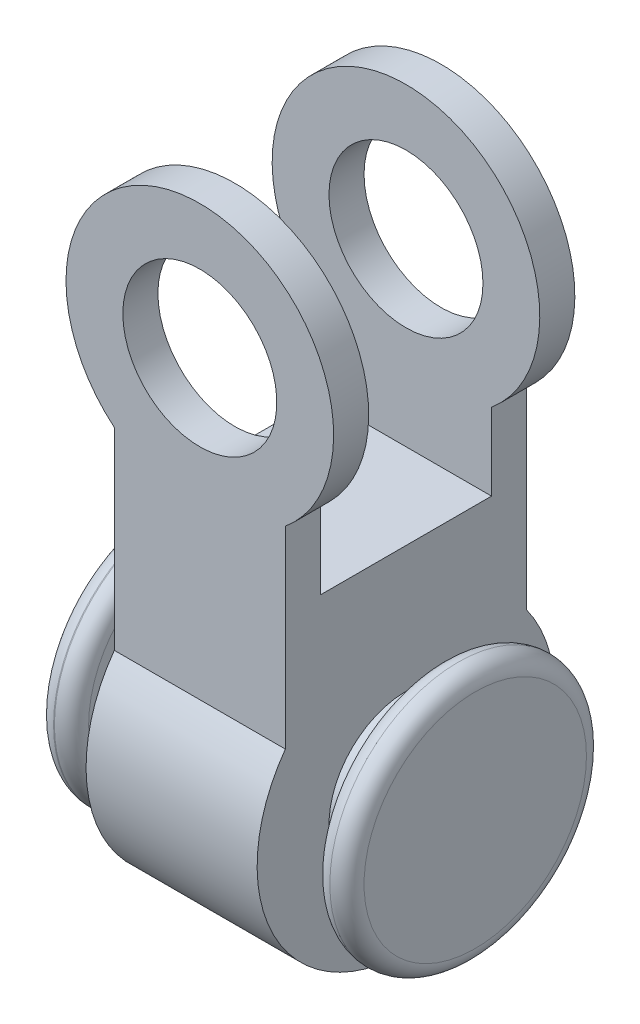
ISO-10303-21;
HEADER;
FILE_DESCRIPTION(('STEP AP214'),'2;1');
FILE_NAME('part.step','',(''),(''),'','','');
FILE_SCHEMA(('AUTOMOTIVE_DESIGN { 1 0 10303 214 1 1 1 1 }'));
ENDSEC;
DATA;
#1=APPLICATION_CONTEXT('core data for automotive mechanical design processes');
#2=APPLICATION_PROTOCOL_DEFINITION('international standard','automotive_design',2000,#1);
#3=PRODUCT_CONTEXT('',#1,'mechanical');
#4=PRODUCT('Part','Part','',(#3));
#5=PRODUCT_RELATED_PRODUCT_CATEGORY('part','',(#4));
#6=PRODUCT_DEFINITION_FORMATION('','',#4);
#7=PRODUCT_DEFINITION_CONTEXT('part definition',#1,'design');
#8=PRODUCT_DEFINITION('design','',#6,#7);
#9=PRODUCT_DEFINITION_SHAPE('','',#8);
#10=(LENGTH_UNIT() NAMED_UNIT(*) SI_UNIT(.MILLI.,.METRE.));
#11=(NAMED_UNIT(*) PLANE_ANGLE_UNIT() SI_UNIT($,.RADIAN.));
#12=(NAMED_UNIT(*) SI_UNIT($,.STERADIAN.) SOLID_ANGLE_UNIT());
#13=UNCERTAINTY_MEASURE_WITH_UNIT(LENGTH_MEASURE(1.E-05),#10,'distance_accuracy_value','');
#14=(GEOMETRIC_REPRESENTATION_CONTEXT(3) GLOBAL_UNCERTAINTY_ASSIGNED_CONTEXT((#13)) GLOBAL_UNIT_ASSIGNED_CONTEXT((#10,
#11,#12)) REPRESENTATION_CONTEXT('',''));
#15=CARTESIAN_POINT('',(0.,0.,0.));
#16=DIRECTION('',(0.,0.,1.));
#17=DIRECTION('',(1.,0.,0.));
#18=AXIS2_PLACEMENT_3D('',#15,#16,#17);
#19=CARTESIAN_POINT('',(100.,0.,0.));
#20=DIRECTION('',(1.,0.,0.));
#21=DIRECTION('',(0.,0.,-1.));
#22=AXIS2_PLACEMENT_3D('',#19,#20,#21);
#23=PLANE('',#22);
#24=CARTESIAN_POINT('',(100.,0.,0.));
#25=DIRECTION('',(1.,0.,0.));
#26=DIRECTION('',(0.,0.,-1.));
#27=AXIS2_PLACEMENT_3D('',#24,#25,#26);
#28=CIRCLE('',#27,45.);
#29=CARTESIAN_POINT('',(100.,0.,-45.));
#30=VERTEX_POINT('',#29);
#31=EDGE_CURVE('E176',#30,#30,#28,.T.);
#32=ORIENTED_EDGE('',*,*,#31,.F.);
#33=EDGE_LOOP('',(#32));
#34=FACE_BOUND('',#33,.T.);
#35=DIRECTION('',(0.,0.,1.));
#36=VECTOR('',#35,1.);
#37=CARTESIAN_POINT('',(100.,118.8,0.));
#38=LINE('',#37,#36);
#39=CARTESIAN_POINT('',(100.,118.8,-50.));
#40=VERTEX_POINT('',#39);
#41=CARTESIAN_POINT('',(100.,118.8,50.));
#42=VERTEX_POINT('',#41);
#43=EDGE_CURVE('E110',#40,#42,#38,.T.);
#44=ORIENTED_EDGE('',*,*,#43,.T.);
#45=DIRECTION('',(0.,1.,0.));
#46=VECTOR('',#45,1.);
#47=CARTESIAN_POINT('',(100.,0.,50.));
#48=LINE('',#47,#46);
#49=CARTESIAN_POINT('',(99.9999999999999,163.846653628768,50.));
#50=VERTEX_POINT('',#49);
#51=EDGE_CURVE('E121',#42,#50,#48,.T.);
#52=ORIENTED_EDGE('',*,*,#51,.T.);
#53=DIRECTION('',(0.,0.,-1.));
#54=VECTOR('',#53,1.);
#55=CARTESIAN_POINT('',(99.9999999999999,163.846653628768,70.5));
#56=LINE('',#55,#54);
#57=CARTESIAN_POINT('',(99.9999999999999,163.846653628768,70.5));
#58=VERTEX_POINT('',#57);
#59=EDGE_CURVE('E144',#58,#50,#56,.T.);
#60=ORIENTED_EDGE('',*,*,#59,.F.);
#61=DIRECTION('',(0.,1.,0.));
#62=VECTOR('',#61,1.);
#63=CARTESIAN_POINT('',(100.,-87.002,70.5));
#64=LINE('',#63,#62);
#65=CARTESIAN_POINT('',(100.,50.9779364038993,70.5));
#66=VERTEX_POINT('',#65);
#67=EDGE_CURVE('E156',#66,#58,#64,.T.);
#68=ORIENTED_EDGE('',*,*,#67,.F.);
#69=CARTESIAN_POINT('',(100.,0.,0.));
#70=DIRECTION('',(1.,0.,0.));
#71=DIRECTION('',(0.,0.,-1.));
#72=AXIS2_PLACEMENT_3D('',#69,#70,#71);
#73=CIRCLE('',#72,87.);
#74=CARTESIAN_POINT('',(100.,50.9779364038993,-70.5));
#75=VERTEX_POINT('',#74);
#76=EDGE_CURVE('E180',#66,#75,#73,.T.);
#77=ORIENTED_EDGE('',*,*,#76,.T.);
#78=DIRECTION('',(0.,1.,0.));
#79=VECTOR('',#78,1.);
#80=CARTESIAN_POINT('',(100.,-87.002,-70.5));
#81=LINE('',#80,#79);
#82=CARTESIAN_POINT('',(99.9999999999999,163.846653628768,-70.5));
#83=VERTEX_POINT('',#82);
#84=EDGE_CURVE('E153',#75,#83,#81,.T.);
#85=ORIENTED_EDGE('',*,*,#84,.T.);
#86=CARTESIAN_POINT('',(99.9999999999999,163.846653628768,-50.));
#87=VERTEX_POINT('',#86);
#88=EDGE_CURVE('E147',#87,#83,#56,.T.);
#89=ORIENTED_EDGE('',*,*,#88,.F.);
#90=DIRECTION('',(0.,-1.,0.));
#91=VECTOR('',#90,1.);
#92=CARTESIAN_POINT('',(100.,0.,-50.));
#93=LINE('',#92,#91);
#94=EDGE_CURVE('E47',#87,#40,#93,.T.);
#95=ORIENTED_EDGE('',*,*,#94,.T.);
#96=EDGE_LOOP('',(#44,#52,#60,#68,#77,#85,#89,#95));
#97=FACE_BOUND('',#96,.T.);
#98=ADVANCED_FACE('F32',(#34,#97),#23,.T.);
#99=CARTESIAN_POINT('',(0.,0.,0.));
#100=DIRECTION('',(1.,0.,0.));
#101=DIRECTION('',(0.,0.,-1.));
#102=AXIS2_PLACEMENT_3D('',#99,#100,#101);
#103=PLANE('',#102);
#104=CARTESIAN_POINT('',(0.,0.,0.));
#105=DIRECTION('',(-1.,0.,0.));
#106=DIRECTION('',(0.,0.,1.));
#107=AXIS2_PLACEMENT_3D('',#104,#105,#106);
#108=CIRCLE('',#107,45.);
#109=CARTESIAN_POINT('',(0.,0.,45.));
#110=VERTEX_POINT('',#109);
#111=EDGE_CURVE('E167',#110,#110,#108,.T.);
#112=ORIENTED_EDGE('',*,*,#111,.F.);
#113=EDGE_LOOP('',(#112));
#114=FACE_BOUND('',#113,.T.);
#115=DIRECTION('',(0.,1.,0.));
#116=VECTOR('',#115,1.);
#117=CARTESIAN_POINT('',(0.,0.,50.));
#118=LINE('',#117,#116);
#119=CARTESIAN_POINT('',(0.,118.8,50.));
#120=VERTEX_POINT('',#119);
#121=CARTESIAN_POINT('',(0.,163.846653628768,50.));
#122=VERTEX_POINT('',#121);
#123=EDGE_CURVE('E116',#120,#122,#118,.T.);
#124=ORIENTED_EDGE('',*,*,#123,.F.);
#125=DIRECTION('',(0.,0.,1.));
#126=VECTOR('',#125,1.);
#127=CARTESIAN_POINT('',(0.,118.8,0.));
#128=LINE('',#127,#126);
#129=CARTESIAN_POINT('',(0.,118.8,-50.));
#130=VERTEX_POINT('',#129);
#131=EDGE_CURVE('E11',#130,#120,#128,.T.);
#132=ORIENTED_EDGE('',*,*,#131,.F.);
#133=DIRECTION('',(0.,-1.,0.));
#134=VECTOR('',#133,1.);
#135=CARTESIAN_POINT('',(0.,0.,-50.));
#136=LINE('',#135,#134);
#137=CARTESIAN_POINT('',(0.,163.846653628768,-50.));
#138=VERTEX_POINT('',#137);
#139=EDGE_CURVE('E95',#138,#130,#136,.T.);
#140=ORIENTED_EDGE('',*,*,#139,.F.);
#141=DIRECTION('',(0.,0.,-1.));
#142=VECTOR('',#141,1.);
#143=CARTESIAN_POINT('',(0.,163.846653628768,70.5));
#144=LINE('',#143,#142);
#145=CARTESIAN_POINT('',(0.,163.846653628768,-70.5));
#146=VERTEX_POINT('',#145);
#147=EDGE_CURVE('E141',#138,#146,#144,.T.);
#148=ORIENTED_EDGE('',*,*,#147,.T.);
#149=DIRECTION('',(0.,1.,0.));
#150=VECTOR('',#149,1.);
#151=CARTESIAN_POINT('',(0.,-87.002,-70.5));
#152=LINE('',#151,#150);
#153=CARTESIAN_POINT('',(0.,50.9779364038993,-70.5));
#154=VERTEX_POINT('',#153);
#155=EDGE_CURVE('E150',#154,#146,#152,.T.);
#156=ORIENTED_EDGE('',*,*,#155,.F.);
#157=CARTESIAN_POINT('',(0.,0.,0.));
#158=DIRECTION('',(1.,0.,0.));
#159=DIRECTION('',(0.,0.,-1.));
#160=AXIS2_PLACEMENT_3D('',#157,#158,#159);
#161=CIRCLE('',#160,87.);
#162=CARTESIAN_POINT('',(0.,50.9779364038993,70.5));
#163=VERTEX_POINT('',#162);
#164=EDGE_CURVE('E175',#163,#154,#161,.T.);
#165=ORIENTED_EDGE('',*,*,#164,.F.);
#166=DIRECTION('',(0.,1.,0.));
#167=VECTOR('',#166,1.);
#168=CARTESIAN_POINT('',(0.,-87.002,70.5));
#169=LINE('',#168,#167);
#170=CARTESIAN_POINT('',(0.,163.846653628768,70.5));
#171=VERTEX_POINT('',#170);
#172=EDGE_CURVE('E157',#163,#171,#169,.T.);
#173=ORIENTED_EDGE('',*,*,#172,.T.);
#174=EDGE_CURVE('E118',#171,#122,#144,.T.);
#175=ORIENTED_EDGE('',*,*,#174,.T.);
#176=EDGE_LOOP('',(#124,#132,#140,#148,#156,#165,#173,#175));
#177=FACE_BOUND('',#176,.T.);
#178=ADVANCED_FACE('F114',(#114,#177),#103,.F.);
#179=CARTESIAN_POINT('',(50.,224.,70.5));
#180=DIRECTION('',(0.,0.,-1.));
#181=DIRECTION('',(-1.,0.,0.));
#182=AXIS2_PLACEMENT_3D('',#179,#180,#181);
#183=CYLINDRICAL_SURFACE('',#182,78.2203623084004);
#184=ORIENTED_EDGE('',*,*,#59,.T.);
#185=CARTESIAN_POINT('',(50.,224.,50.));
#186=DIRECTION('',(0.,0.,-1.));
#187=DIRECTION('',(-1.,0.,0.));
#188=AXIS2_PLACEMENT_3D('',#185,#186,#187);
#189=CIRCLE('',#188,78.2203623084004);
#190=EDGE_CURVE('E122',#50,#122,#189,.F.);
#191=ORIENTED_EDGE('',*,*,#190,.T.);
#192=ORIENTED_EDGE('',*,*,#174,.F.);
#193=CARTESIAN_POINT('',(50.,224.,70.5));
#194=DIRECTION('',(0.,0.,-1.));
#195=DIRECTION('',(-1.,0.,0.));
#196=AXIS2_PLACEMENT_3D('',#193,#194,#195);
#197=CIRCLE('',#196,78.2203623084004);
#198=EDGE_CURVE('E138',#171,#58,#197,.T.);
#199=ORIENTED_EDGE('',*,*,#198,.T.);
#200=EDGE_LOOP('',(#184,#191,#192,#199));
#201=FACE_BOUND('',#200,.T.);
#202=ADVANCED_FACE('F211',(#201),#183,.T.);
#203=ORIENTED_EDGE('',*,*,#147,.F.);
#204=CARTESIAN_POINT('',(50.,224.,-50.));
#205=DIRECTION('',(0.,0.,1.));
#206=DIRECTION('',(1.,0.,0.));
#207=AXIS2_PLACEMENT_3D('',#204,#205,#206);
#208=CIRCLE('',#207,78.2203623084004);
#209=EDGE_CURVE('E100',#138,#87,#208,.F.);
#210=ORIENTED_EDGE('',*,*,#209,.T.);
#211=ORIENTED_EDGE('',*,*,#88,.T.);
#212=CARTESIAN_POINT('',(50.,224.,-70.5));
#213=DIRECTION('',(0.,0.,-1.));
#214=DIRECTION('',(-1.,0.,0.));
#215=AXIS2_PLACEMENT_3D('',#212,#213,#214);
#216=CIRCLE('',#215,78.2203623084004);
#217=EDGE_CURVE('E135',#146,#83,#216,.T.);
#218=ORIENTED_EDGE('',*,*,#217,.F.);
#219=EDGE_LOOP('',(#203,#210,#211,#218));
#220=FACE_BOUND('',#219,.T.);
#221=ADVANCED_FACE('F225',(#220),#183,.T.);
#222=CARTESIAN_POINT('',(50.,224.,70.5));
#223=DIRECTION('',(0.,0.,-1.));
#224=DIRECTION('',(-1.,0.,0.));
#225=AXIS2_PLACEMENT_3D('',#222,#223,#224);
#226=CYLINDRICAL_SURFACE('',#225,45.);
#227=CARTESIAN_POINT('',(50.,224.,70.5));
#228=DIRECTION('',(0.,0.,-1.));
#229=DIRECTION('',(-1.,0.,0.));
#230=AXIS2_PLACEMENT_3D('',#227,#228,#229);
#231=CIRCLE('',#230,45.);
#232=CARTESIAN_POINT('',(4.99999999999999,224.,70.5));
#233=VERTEX_POINT('',#232);
#234=EDGE_CURVE('E132',#233,#233,#231,.T.);
#235=ORIENTED_EDGE('',*,*,#234,.F.);
#236=EDGE_LOOP('',(#235));
#237=FACE_BOUND('',#236,.T.);
#238=CARTESIAN_POINT('',(50.,224.,50.));
#239=DIRECTION('',(0.,0.,-1.));
#240=DIRECTION('',(-1.,0.,0.));
#241=AXIS2_PLACEMENT_3D('',#238,#239,#240);
#242=CIRCLE('',#241,45.);
#243=CARTESIAN_POINT('',(4.99999999999999,224.,50.));
#244=VERTEX_POINT('',#243);
#245=EDGE_CURVE('E126',#244,#244,#242,.F.);
#246=ORIENTED_EDGE('',*,*,#245,.F.);
#247=EDGE_LOOP('',(#246));
#248=FACE_BOUND('',#247,.T.);
#249=ADVANCED_FACE('F238',(#237,#248),#226,.F.);
#250=CARTESIAN_POINT('',(50.,224.,-70.5));
#251=DIRECTION('',(0.,0.,-1.));
#252=DIRECTION('',(-1.,0.,0.));
#253=AXIS2_PLACEMENT_3D('',#250,#251,#252);
#254=CIRCLE('',#253,45.);
#255=CARTESIAN_POINT('',(5.00000000000001,224.,-70.5));
#256=VERTEX_POINT('',#255);
#257=EDGE_CURVE('E131',#256,#256,#254,.T.);
#258=ORIENTED_EDGE('',*,*,#257,.T.);
#259=EDGE_LOOP('',(#258));
#260=FACE_BOUND('',#259,.T.);
#261=CARTESIAN_POINT('',(50.,224.,-50.));
#262=DIRECTION('',(0.,0.,1.));
#263=DIRECTION('',(1.,0.,0.));
#264=AXIS2_PLACEMENT_3D('',#261,#262,#263);
#265=CIRCLE('',#264,45.);
#266=CARTESIAN_POINT('',(95.,224.,-50.));
#267=VERTEX_POINT('',#266);
#268=EDGE_CURVE('E199',#267,#267,#265,.F.);
#269=ORIENTED_EDGE('',*,*,#268,.F.);
#270=EDGE_LOOP('',(#269));
#271=FACE_BOUND('',#270,.T.);
#272=ADVANCED_FACE('F229',(#260,#271),#226,.F.);
#273=CARTESIAN_POINT('',(100.,0.,0.));
#274=DIRECTION('',(-1.,0.,0.));
#275=DIRECTION('',(0.,0.,1.));
#276=AXIS2_PLACEMENT_3D('',#273,#274,#275);
#277=CYLINDRICAL_SURFACE('',#276,87.);
#278=ORIENTED_EDGE('',*,*,#164,.T.);
#279=DIRECTION('',(-1.,0.,0.));
#280=VECTOR('',#279,1.);
#281=CARTESIAN_POINT('',(100.,50.9779364038994,-70.4999999999999));
#282=LINE('',#281,#280);
#283=EDGE_CURVE('E55',#75,#154,#282,.T.);
#284=ORIENTED_EDGE('',*,*,#283,.F.);
#285=ORIENTED_EDGE('',*,*,#76,.F.);
#286=DIRECTION('',(-1.,0.,0.));
#287=VECTOR('',#286,1.);
#288=CARTESIAN_POINT('',(100.,50.9779364038994,70.4999999999999));
#289=LINE('',#288,#287);
#290=EDGE_CURVE('E159',#163,#66,#289,.F.);
#291=ORIENTED_EDGE('',*,*,#290,.F.);
#292=EDGE_LOOP('',(#278,#284,#285,#291));
#293=FACE_BOUND('',#292,.T.);
#294=ADVANCED_FACE('F226',(#293),#277,.T.);
#295=CARTESIAN_POINT('',(120.5,0.,0.));
#296=DIRECTION('',(-1.,0.,0.));
#297=DIRECTION('',(0.,0.,1.));
#298=AXIS2_PLACEMENT_3D('',#295,#296,#297);
#299=CYLINDRICAL_SURFACE('',#298,45.);
#300=CARTESIAN_POINT('',(120.5,0.,0.));
#301=DIRECTION('',(1.,0.,0.));
#302=DIRECTION('',(0.,0.,-1.));
#303=AXIS2_PLACEMENT_3D('',#300,#301,#302);
#304=CIRCLE('',#303,45.);
#305=CARTESIAN_POINT('',(120.5,0.,-45.));
#306=VERTEX_POINT('',#305);
#307=EDGE_CURVE('E172',#306,#306,#304,.T.);
#308=ORIENTED_EDGE('',*,*,#307,.F.);
#309=EDGE_LOOP('',(#308));
#310=FACE_BOUND('',#309,.T.);
#311=ORIENTED_EDGE('',*,*,#31,.T.);
#312=EDGE_LOOP('',(#311));
#313=FACE_BOUND('',#312,.T.);
#314=ADVANCED_FACE('F228',(#310,#313),#299,.T.);
#315=CARTESIAN_POINT('',(140.5,0.,0.));
#316=DIRECTION('',(1.,0.,0.));
#317=DIRECTION('',(0.,0.,-1.));
#318=AXIS2_PLACEMENT_3D('',#315,#316,#317);
#319=PLANE('',#318);
#320=CARTESIAN_POINT('',(140.5,0.,0.));
#321=DIRECTION('',(1.,0.,0.));
#322=DIRECTION('',(0.,0.,-1.));
#323=AXIS2_PLACEMENT_3D('',#320,#321,#322);
#324=CIRCLE('',#323,65.);
#325=CARTESIAN_POINT('',(140.5,0.,-65.));
#326=VERTEX_POINT('',#325);
#327=EDGE_CURVE('E171',#326,#326,#324,.T.);
#328=ORIENTED_EDGE('',*,*,#327,.T.);
#329=EDGE_LOOP('',(#328));
#330=FACE_BOUND('',#329,.T.);
#331=ADVANCED_FACE('F235',(#330),#319,.T.);
#332=CARTESIAN_POINT('',(120.5,0.,0.));
#333=DIRECTION('',(1.,0.,0.));
#334=DIRECTION('',(0.,0.,-1.));
#335=AXIS2_PLACEMENT_3D('',#332,#333,#334);
#336=PLANE('',#335);
#337=CARTESIAN_POINT('',(120.5,0.,0.));
#338=DIRECTION('',(1.,0.,0.));
#339=DIRECTION('',(0.,0.,-1.));
#340=AXIS2_PLACEMENT_3D('',#337,#338,#339);
#341=CIRCLE('',#340,65.);
#342=CARTESIAN_POINT('',(120.5,0.,-65.));
#343=VERTEX_POINT('',#342);
#344=EDGE_CURVE('E179',#343,#343,#341,.F.);
#345=ORIENTED_EDGE('',*,*,#344,.T.);
#346=EDGE_LOOP('',(#345));
#347=FACE_BOUND('',#346,.T.);
#348=ORIENTED_EDGE('',*,*,#307,.T.);
#349=EDGE_LOOP('',(#348));
#350=FACE_BOUND('',#349,.T.);
#351=ADVANCED_FACE('F252',(#347,#350),#336,.F.);
#352=CARTESIAN_POINT('',(130.5,0.,0.));
#353=DIRECTION('',(1.,0.,0.));
#354=DIRECTION('',(0.,0.,-1.));
#355=AXIS2_PLACEMENT_3D('',#352,#353,#354);
#356=TOROIDAL_SURFACE('',#355,65.,10.);
#357=ORIENTED_EDGE('',*,*,#327,.F.);
#358=EDGE_LOOP('',(#357));
#359=FACE_BOUND('',#358,.T.);
#360=CARTESIAN_POINT('',(130.5,0.,0.));
#361=DIRECTION('',(1.,0.,0.));
#362=DIRECTION('',(0.,0.,-1.));
#363=AXIS2_PLACEMENT_3D('',#360,#361,#362);
#364=CIRCLE('',#363,75.);
#365=CARTESIAN_POINT('',(130.5,0.,-75.));
#366=VERTEX_POINT('',#365);
#367=EDGE_CURVE('E166',#366,#366,#364,.F.);
#368=ORIENTED_EDGE('',*,*,#367,.F.);
#369=EDGE_LOOP('',(#368));
#370=FACE_BOUND('',#369,.T.);
#371=ADVANCED_FACE('F255',(#359,#370),#356,.T.);
#372=CARTESIAN_POINT('',(130.5,0.,0.));
#373=DIRECTION('',(1.,0.,0.));
#374=DIRECTION('',(0.,0.,-1.));
#375=AXIS2_PLACEMENT_3D('',#372,#373,#374);
#376=TOROIDAL_SURFACE('',#375,65.,10.);
#377=ORIENTED_EDGE('',*,*,#344,.F.);
#378=EDGE_LOOP('',(#377));
#379=FACE_BOUND('',#378,.T.);
#380=ORIENTED_EDGE('',*,*,#367,.T.);
#381=EDGE_LOOP('',(#380));
#382=FACE_BOUND('',#381,.T.);
#383=ADVANCED_FACE('F264',(#379,#382),#376,.T.);
#384=CARTESIAN_POINT('',(-20.5,0.,0.));
#385=DIRECTION('',(1.,0.,0.));
#386=DIRECTION('',(0.,0.,-1.));
#387=AXIS2_PLACEMENT_3D('',#384,#385,#386);
#388=CYLINDRICAL_SURFACE('',#387,45.);
#389=CARTESIAN_POINT('',(-20.5,0.,0.));
#390=DIRECTION('',(-1.,0.,0.));
#391=DIRECTION('',(0.,0.,1.));
#392=AXIS2_PLACEMENT_3D('',#389,#390,#391);
#393=CIRCLE('',#392,45.);
#394=CARTESIAN_POINT('',(-20.5,0.,45.));
#395=VERTEX_POINT('',#394);
#396=EDGE_CURVE('E163',#395,#395,#393,.T.);
#397=ORIENTED_EDGE('',*,*,#396,.F.);
#398=EDGE_LOOP('',(#397));
#399=FACE_BOUND('',#398,.T.);
#400=ORIENTED_EDGE('',*,*,#111,.T.);
#401=EDGE_LOOP('',(#400));
#402=FACE_BOUND('',#401,.T.);
#403=ADVANCED_FACE('F260',(#399,#402),#388,.T.);
#404=CARTESIAN_POINT('',(-41.,0.,0.));
#405=DIRECTION('',(1.,0.,0.));
#406=DIRECTION('',(0.,0.,-1.));
#407=AXIS2_PLACEMENT_3D('',#404,#405,#406);
#408=CYLINDRICAL_SURFACE('',#407,75.);
#409=CARTESIAN_POINT('',(-30.5,0.,0.));
#410=DIRECTION('',(-1.,0.,0.));
#411=DIRECTION('',(0.,0.,1.));
#412=AXIS2_PLACEMENT_3D('',#409,#410,#411);
#413=CIRCLE('',#412,75.);
#414=CARTESIAN_POINT('',(-30.5,0.,75.));
#415=VERTEX_POINT('',#414);
#416=EDGE_CURVE('E191',#415,#415,#413,.T.);
#417=ORIENTED_EDGE('',*,*,#416,.T.);
#418=EDGE_LOOP('',(#417));
#419=FACE_BOUND('',#418,.T.);
#420=CARTESIAN_POINT('',(-31.,0.,0.));
#421=DIRECTION('',(-1.,0.,0.));
#422=DIRECTION('',(0.,0.,1.));
#423=AXIS2_PLACEMENT_3D('',#420,#421,#422);
#424=CIRCLE('',#423,75.);
#425=CARTESIAN_POINT('',(-31.,0.,75.));
#426=VERTEX_POINT('',#425);
#427=EDGE_CURVE('E170',#426,#426,#424,.F.);
#428=ORIENTED_EDGE('',*,*,#427,.T.);
#429=EDGE_LOOP('',(#428));
#430=FACE_BOUND('',#429,.T.);
#431=ADVANCED_FACE('F263',(#419,#430),#408,.T.);
#432=CARTESIAN_POINT('',(-41.,0.,0.));
#433=DIRECTION('',(-1.,0.,0.));
#434=DIRECTION('',(0.,0.,1.));
#435=AXIS2_PLACEMENT_3D('',#432,#433,#434);
#436=PLANE('',#435);
#437=CARTESIAN_POINT('',(-41.,0.,0.));
#438=DIRECTION('',(-1.,0.,0.));
#439=DIRECTION('',(0.,0.,1.));
#440=AXIS2_PLACEMENT_3D('',#437,#438,#439);
#441=CIRCLE('',#440,65.);
#442=CARTESIAN_POINT('',(-41.,0.,65.));
#443=VERTEX_POINT('',#442);
#444=EDGE_CURVE('E40',#443,#443,#441,.T.);
#445=ORIENTED_EDGE('',*,*,#444,.T.);
#446=EDGE_LOOP('',(#445));
#447=FACE_BOUND('',#446,.T.);
#448=ADVANCED_FACE('F268',(#447),#436,.T.);
#449=CARTESIAN_POINT('',(-20.5,0.,0.));
#450=DIRECTION('',(-1.,0.,0.));
#451=DIRECTION('',(0.,0.,1.));
#452=AXIS2_PLACEMENT_3D('',#449,#450,#451);
#453=PLANE('',#452);
#454=CARTESIAN_POINT('',(-20.5,0.,0.));
#455=DIRECTION('',(-1.,0.,0.));
#456=DIRECTION('',(0.,0.,1.));
#457=AXIS2_PLACEMENT_3D('',#454,#455,#456);
#458=CIRCLE('',#457,65.);
#459=CARTESIAN_POINT('',(-20.5,0.,65.));
#460=VERTEX_POINT('',#459);
#461=EDGE_CURVE('E194',#460,#460,#458,.F.);
#462=ORIENTED_EDGE('',*,*,#461,.T.);
#463=EDGE_LOOP('',(#462));
#464=FACE_BOUND('',#463,.T.);
#465=ORIENTED_EDGE('',*,*,#396,.T.);
#466=EDGE_LOOP('',(#465));
#467=FACE_BOUND('',#466,.T.);
#468=ADVANCED_FACE('F270',(#464,#467),#453,.F.);
#469=CARTESIAN_POINT('',(-30.5,0.,0.));
#470=DIRECTION('',(-1.,0.,0.));
#471=DIRECTION('',(0.,0.,1.));
#472=AXIS2_PLACEMENT_3D('',#469,#470,#471);
#473=TOROIDAL_SURFACE('',#472,65.,10.);
#474=ORIENTED_EDGE('',*,*,#461,.F.);
#475=EDGE_LOOP('',(#474));
#476=FACE_BOUND('',#475,.T.);
#477=ORIENTED_EDGE('',*,*,#416,.F.);
#478=EDGE_LOOP('',(#477));
#479=FACE_BOUND('',#478,.T.);
#480=ADVANCED_FACE('F273',(#476,#479),#473,.T.);
#481=CARTESIAN_POINT('',(-31.,0.,0.));
#482=DIRECTION('',(-1.,0.,0.));
#483=DIRECTION('',(0.,0.,1.));
#484=AXIS2_PLACEMENT_3D('',#481,#482,#483);
#485=TOROIDAL_SURFACE('',#484,65.,10.);
#486=ORIENTED_EDGE('',*,*,#427,.F.);
#487=EDGE_LOOP('',(#486));
#488=FACE_BOUND('',#487,.T.);
#489=ORIENTED_EDGE('',*,*,#444,.F.);
#490=EDGE_LOOP('',(#489));
#491=FACE_BOUND('',#490,.T.);
#492=ADVANCED_FACE('F34',(#488,#491),#485,.T.);
#493=CARTESIAN_POINT('',(100.,-87.002,70.5));
#494=DIRECTION('',(0.,0.,1.));
#495=DIRECTION('',(1.,0.,0.));
#496=AXIS2_PLACEMENT_3D('',#493,#494,#495);
#497=PLANE('',#496);
#498=ORIENTED_EDGE('',*,*,#172,.F.);
#499=ORIENTED_EDGE('',*,*,#290,.T.);
#500=ORIENTED_EDGE('',*,*,#67,.T.);
#501=ORIENTED_EDGE('',*,*,#198,.F.);
#502=EDGE_LOOP('',(#498,#499,#500,#501));
#503=FACE_BOUND('',#502,.T.);
#504=ORIENTED_EDGE('',*,*,#234,.T.);
#505=EDGE_LOOP('',(#504));
#506=FACE_BOUND('',#505,.T.);
#507=ADVANCED_FACE('F215',(#503,#506),#497,.T.);
#508=CARTESIAN_POINT('',(100.,-87.002,-70.5));
#509=DIRECTION('',(0.,0.,-1.));
#510=DIRECTION('',(-1.,0.,0.));
#511=AXIS2_PLACEMENT_3D('',#508,#509,#510);
#512=PLANE('',#511);
#513=ORIENTED_EDGE('',*,*,#84,.F.);
#514=ORIENTED_EDGE('',*,*,#283,.T.);
#515=ORIENTED_EDGE('',*,*,#155,.T.);
#516=ORIENTED_EDGE('',*,*,#217,.T.);
#517=EDGE_LOOP('',(#513,#514,#515,#516));
#518=FACE_BOUND('',#517,.T.);
#519=ORIENTED_EDGE('',*,*,#257,.F.);
#520=EDGE_LOOP('',(#519));
#521=FACE_BOUND('',#520,.T.);
#522=ADVANCED_FACE('F220',(#518,#521),#512,.T.);
#523=CARTESIAN_POINT('',(-41.0000000000001,118.8,-50.));
#524=DIRECTION('',(0.,1.,0.));
#525=DIRECTION('',(-1.,0.,0.));
#526=AXIS2_PLACEMENT_3D('',#523,#524,#525);
#527=PLANE('',#526);
#528=DIRECTION('',(1.,0.,0.));
#529=VECTOR('',#528,1.);
#530=CARTESIAN_POINT('',(-41.0000000000001,118.8,-50.));
#531=LINE('',#530,#529);
#532=EDGE_CURVE('E99',#130,#40,#531,.T.);
#533=ORIENTED_EDGE('',*,*,#532,.F.);
#534=ORIENTED_EDGE('',*,*,#131,.T.);
#535=DIRECTION('',(1.,0.,0.));
#536=VECTOR('',#535,1.);
#537=CARTESIAN_POINT('',(-41.0000000000001,118.8,50.));
#538=LINE('',#537,#536);
#539=EDGE_CURVE('E111',#120,#42,#538,.T.);
#540=ORIENTED_EDGE('',*,*,#539,.T.);
#541=ORIENTED_EDGE('',*,*,#43,.F.);
#542=EDGE_LOOP('',(#533,#534,#540,#541));
#543=FACE_BOUND('',#542,.T.);
#544=ADVANCED_FACE('F106',(#543),#527,.T.);
#545=CARTESIAN_POINT('',(-41.0000000000002,335.569628827252,50.));
#546=DIRECTION('',(0.,0.,-1.));
#547=DIRECTION('',(-1.,0.,0.));
#548=AXIS2_PLACEMENT_3D('',#545,#546,#547);
#549=PLANE('',#548);
#550=ORIENTED_EDGE('',*,*,#539,.F.);
#551=ORIENTED_EDGE('',*,*,#123,.T.);
#552=ORIENTED_EDGE('',*,*,#190,.F.);
#553=ORIENTED_EDGE('',*,*,#51,.F.);
#554=EDGE_LOOP('',(#550,#551,#552,#553));
#555=FACE_BOUND('',#554,.T.);
#556=ORIENTED_EDGE('',*,*,#245,.T.);
#557=EDGE_LOOP('',(#556));
#558=FACE_BOUND('',#557,.T.);
#559=ADVANCED_FACE('F288',(#555,#558),#549,.T.);
#560=CARTESIAN_POINT('',(-41.0000000000002,335.569628827252,-50.));
#561=DIRECTION('',(0.,0.,1.));
#562=DIRECTION('',(1.,0.,0.));
#563=AXIS2_PLACEMENT_3D('',#560,#561,#562);
#564=PLANE('',#563);
#565=ORIENTED_EDGE('',*,*,#209,.F.);
#566=ORIENTED_EDGE('',*,*,#139,.T.);
#567=ORIENTED_EDGE('',*,*,#532,.T.);
#568=ORIENTED_EDGE('',*,*,#94,.F.);
#569=EDGE_LOOP('',(#565,#566,#567,#568));
#570=FACE_BOUND('',#569,.T.);
#571=ORIENTED_EDGE('',*,*,#268,.T.);
#572=EDGE_LOOP('',(#571));
#573=FACE_BOUND('',#572,.T.);
#574=ADVANCED_FACE('F97',(#570,#573),#564,.T.);
#575=CLOSED_SHELL('',(#98,#178,#202,#221,#249,#272,#294,#314,#331,#351,#371,#383,#403,#431,#448,
#468,#480,#492,#507,#522,#544,#559,#574));
#576=MANIFOLD_SOLID_BREP('B2',#575);
#577=ADVANCED_BREP_SHAPE_REPRESENTATION('',(#18,#576),#14);
#578=SHAPE_DEFINITION_REPRESENTATION(#9,#577);
ENDSEC;
END-ISO-10303-21;
